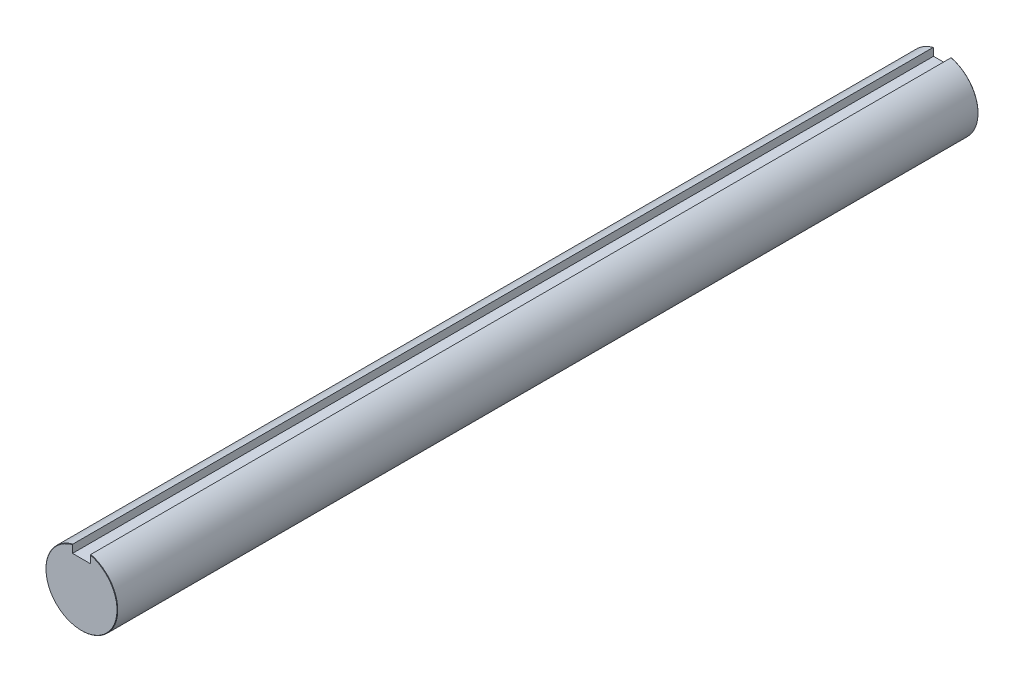
ISO-10303-21;
HEADER;
FILE_DESCRIPTION(('STEP AP214'),'2;1');
FILE_NAME('part.step','',(''),(''),'','','');
FILE_SCHEMA(('AUTOMOTIVE_DESIGN { 1 0 10303 214 1 1 1 1 }'));
ENDSEC;
DATA;
#1=APPLICATION_CONTEXT('core data for automotive mechanical design processes');
#2=APPLICATION_PROTOCOL_DEFINITION('international standard','automotive_design',2000,#1);
#3=PRODUCT_CONTEXT('',#1,'mechanical');
#4=PRODUCT('Part','Part','',(#3));
#5=PRODUCT_RELATED_PRODUCT_CATEGORY('part','',(#4));
#6=PRODUCT_DEFINITION_FORMATION('','',#4);
#7=PRODUCT_DEFINITION_CONTEXT('part definition',#1,'design');
#8=PRODUCT_DEFINITION('design','',#6,#7);
#9=PRODUCT_DEFINITION_SHAPE('','',#8);
#10=(LENGTH_UNIT() NAMED_UNIT(*) SI_UNIT(.MILLI.,.METRE.));
#11=(NAMED_UNIT(*) PLANE_ANGLE_UNIT() SI_UNIT($,.RADIAN.));
#12=(NAMED_UNIT(*) SI_UNIT($,.STERADIAN.) SOLID_ANGLE_UNIT());
#13=UNCERTAINTY_MEASURE_WITH_UNIT(LENGTH_MEASURE(1.E-05),#10,'distance_accuracy_value','');
#14=(GEOMETRIC_REPRESENTATION_CONTEXT(3) GLOBAL_UNCERTAINTY_ASSIGNED_CONTEXT((#13)) GLOBAL_UNIT_ASSIGNED_CONTEXT((#10,
#11,#12)) REPRESENTATION_CONTEXT('',''));
#15=CARTESIAN_POINT('',(0.,0.,0.));
#16=DIRECTION('',(0.,0.,1.));
#17=DIRECTION('',(1.,0.,0.));
#18=AXIS2_PLACEMENT_3D('',#15,#16,#17);
#19=CARTESIAN_POINT('',(0.,0.,76.2));
#20=DIRECTION('',(0.,0.,-1.));
#21=DIRECTION('',(-1.,0.,0.));
#22=AXIS2_PLACEMENT_3D('',#19,#20,#21);
#23=CYLINDRICAL_SURFACE('',#22,6.35);
#24=DIRECTION('',(0.,0.,-1.));
#25=VECTOR('',#24,1.);
#26=CARTESIAN_POINT('',(1.5875,6.14836106210427,76.2));
#27=LINE('',#26,#25);
#28=CARTESIAN_POINT('',(1.5875,6.14836106210427,76.1365000000001));
#29=VERTEX_POINT('',#28);
#30=CARTESIAN_POINT('',(1.5875,6.14836106210427,-76.1364999999998));
#31=VERTEX_POINT('',#30);
#32=EDGE_CURVE('E104',#29,#31,#27,.T.);
#33=ORIENTED_EDGE('',*,*,#32,.F.);
#34=CARTESIAN_POINT('',(0.,0.,76.1365000000001));
#35=DIRECTION('',(0.,0.,1.));
#36=DIRECTION('',(1.,0.,0.));
#37=AXIS2_PLACEMENT_3D('',#34,#35,#36);
#38=CIRCLE('',#37,6.35);
#39=CARTESIAN_POINT('',(-1.5875,6.14836106210427,76.1365000000001));
#40=VERTEX_POINT('',#39);
#41=EDGE_CURVE('E220',#29,#40,#38,.F.);
#42=ORIENTED_EDGE('',*,*,#41,.T.);
#43=DIRECTION('',(0.,0.,-1.));
#44=VECTOR('',#43,1.);
#45=CARTESIAN_POINT('',(-1.5875,6.14836106210427,76.2));
#46=LINE('',#45,#44);
#47=CARTESIAN_POINT('',(-1.5875,6.14836106210427,-76.1364999999998));
#48=VERTEX_POINT('',#47);
#49=EDGE_CURVE('E118',#40,#48,#46,.T.);
#50=ORIENTED_EDGE('',*,*,#49,.T.);
#51=CARTESIAN_POINT('',(0.,0.,-76.1364999999998));
#52=DIRECTION('',(0.,0.,1.));
#53=DIRECTION('',(1.,0.,0.));
#54=AXIS2_PLACEMENT_3D('',#51,#52,#53);
#55=CIRCLE('',#54,6.35);
#56=EDGE_CURVE('E219',#48,#31,#55,.T.);
#57=ORIENTED_EDGE('',*,*,#56,.T.);
#58=EDGE_LOOP('',(#33,#42,#50,#57));
#59=FACE_BOUND('',#58,.T.);
#60=ADVANCED_FACE('F34',(#59),#23,.T.);
#61=CARTESIAN_POINT('',(1.5875,4.7498,76.2));
#62=DIRECTION('',(1.,0.,0.));
#63=DIRECTION('',(0.,0.,-1.));
#64=AXIS2_PLACEMENT_3D('',#61,#62,#63);
#65=PLANE('',#64);
#66=DIRECTION('',(0.,-1.,0.));
#67=VECTOR('',#66,1.);
#68=CARTESIAN_POINT('',(1.5875,4.7498,76.2));
#69=LINE('',#68,#67);
#70=CARTESIAN_POINT('',(1.5875,6.0827564475327,76.2));
#71=VERTEX_POINT('',#70);
#72=CARTESIAN_POINT('',(1.5875,4.7498,76.2));
#73=VERTEX_POINT('',#72);
#74=EDGE_CURVE('E110',#71,#73,#69,.T.);
#75=ORIENTED_EDGE('',*,*,#74,.F.);
#76=CARTESIAN_POINT('',(1.5875,6.0827564475327,76.2));
#77=CARTESIAN_POINT('',(1.5875,6.09369234087876,76.1894185169407));
#78=CARTESIAN_POINT('',(1.5875,6.10462733876629,76.1788361087442));
#79=CARTESIAN_POINT('',(1.5875,6.12649554362348,76.1576694420775));
#80=CARTESIAN_POINT('',(1.5875,6.13742875059314,76.1470851836074));
#81=CARTESIAN_POINT('',(1.5875,6.14836106210428,76.1365000000001));
#82=B_SPLINE_CURVE_WITH_KNOTS('',3,(#76,#77,#78,#79,#80,#81),.UNSPECIFIED.,.F.,.F.,(4,2,4),(0.,
0.0456514389514626,0.0913028778996394),.UNSPECIFIED.);
#83=EDGE_CURVE('E130',#71,#29,#82,.T.);
#84=ORIENTED_EDGE('',*,*,#83,.T.);
#85=ORIENTED_EDGE('',*,*,#32,.T.);
#86=CARTESIAN_POINT('',(1.5875,6.14836106210427,-76.1364999999998));
#87=CARTESIAN_POINT('',(1.5875,6.1374287505931,-76.1470851836072));
#88=CARTESIAN_POINT('',(1.5875,6.1264955436234,-76.1576694420774));
#89=CARTESIAN_POINT('',(1.5875,6.10462733876614,-76.1788361087441));
#90=CARTESIAN_POINT('',(1.5875,6.09369234087859,-76.1894185169406));
#91=CARTESIAN_POINT('',(1.5875,6.0827564475325,-76.2));
#92=B_SPLINE_CURVE_WITH_KNOTS('',3,(#86,#87,#88,#89,#90,#91),.UNSPECIFIED.,.F.,.F.,(4,2,4),(0.,
0.0456514389483216,0.0913028778999325),.UNSPECIFIED.);
#93=CARTESIAN_POINT('',(1.5875,6.08275644753249,-76.2));
#94=VERTEX_POINT('',#93);
#95=EDGE_CURVE('E95',#31,#94,#92,.T.);
#96=ORIENTED_EDGE('',*,*,#95,.T.);
#97=DIRECTION('',(0.,-1.,0.));
#98=VECTOR('',#97,1.);
#99=CARTESIAN_POINT('',(1.5875,4.7498,-76.2));
#100=LINE('',#99,#98);
#101=CARTESIAN_POINT('',(1.5875,4.7498,-76.2));
#102=VERTEX_POINT('',#101);
#103=EDGE_CURVE('E88',#94,#102,#100,.T.);
#104=ORIENTED_EDGE('',*,*,#103,.T.);
#105=DIRECTION('',(0.,0.,-1.));
#106=VECTOR('',#105,1.);
#107=CARTESIAN_POINT('',(1.5875,4.7498,76.2));
#108=LINE('',#107,#106);
#109=EDGE_CURVE('E92',#73,#102,#108,.T.);
#110=ORIENTED_EDGE('',*,*,#109,.F.);
#111=EDGE_LOOP('',(#75,#84,#85,#96,#104,#110));
#112=FACE_BOUND('',#111,.T.);
#113=ADVANCED_FACE('F91',(#112),#65,.F.);
#114=CARTESIAN_POINT('',(1.5875,4.7498,76.2));
#115=DIRECTION('',(0.,-1.,0.));
#116=DIRECTION('',(0.,0.,-1.));
#117=AXIS2_PLACEMENT_3D('',#114,#115,#116);
#118=PLANE('',#117);
#119=ORIENTED_EDGE('',*,*,#109,.T.);
#120=DIRECTION('',(-1.,0.,0.));
#121=VECTOR('',#120,1.);
#122=CARTESIAN_POINT('',(1.5875,4.7498,-76.2));
#123=LINE('',#122,#121);
#124=CARTESIAN_POINT('',(-1.5875,4.7498,-76.2));
#125=VERTEX_POINT('',#124);
#126=EDGE_CURVE('E97',#102,#125,#123,.T.);
#127=ORIENTED_EDGE('',*,*,#126,.T.);
#128=DIRECTION('',(0.,0.,-1.));
#129=VECTOR('',#128,1.);
#130=CARTESIAN_POINT('',(-1.5875,4.7498,76.2));
#131=LINE('',#130,#129);
#132=CARTESIAN_POINT('',(-1.5875,4.7498,76.2));
#133=VERTEX_POINT('',#132);
#134=EDGE_CURVE('E105',#133,#125,#131,.T.);
#135=ORIENTED_EDGE('',*,*,#134,.F.);
#136=DIRECTION('',(-1.,0.,0.));
#137=VECTOR('',#136,1.);
#138=CARTESIAN_POINT('',(1.5875,4.7498,76.2));
#139=LINE('',#138,#137);
#140=EDGE_CURVE('E103',#73,#133,#139,.T.);
#141=ORIENTED_EDGE('',*,*,#140,.F.);
#142=EDGE_LOOP('',(#119,#127,#135,#141));
#143=FACE_BOUND('',#142,.T.);
#144=ADVANCED_FACE('F101',(#143),#118,.F.);
#145=CARTESIAN_POINT('',(-1.5875,4.7498,76.2));
#146=DIRECTION('',(-1.,0.,0.));
#147=DIRECTION('',(0.,0.,1.));
#148=AXIS2_PLACEMENT_3D('',#145,#146,#147);
#149=PLANE('',#148);
#150=ORIENTED_EDGE('',*,*,#49,.F.);
#151=CARTESIAN_POINT('',(-1.5875,6.14836106210427,76.1365000000001));
#152=CARTESIAN_POINT('',(-1.5875,6.13742875059314,76.1470851836074));
#153=CARTESIAN_POINT('',(-1.5875,6.12649554362347,76.1576694420775));
#154=CARTESIAN_POINT('',(-1.5875,6.10462733876629,76.1788361087442));
#155=CARTESIAN_POINT('',(-1.5875,6.09369234087876,76.1894185169407));
#156=CARTESIAN_POINT('',(-1.5875,6.08275644753271,76.2));
#157=B_SPLINE_CURVE_WITH_KNOTS('',3,(#151,#152,#153,#154,#155,#156),.UNSPECIFIED.,.F.,.F.,(4,2,
4),(0.,0.0456514389481653,0.0913028778996338),.UNSPECIFIED.);
#158=CARTESIAN_POINT('',(-1.5875,6.0827564475327,76.2));
#159=VERTEX_POINT('',#158);
#160=EDGE_CURVE('E43',#40,#159,#157,.T.);
#161=ORIENTED_EDGE('',*,*,#160,.T.);
#162=DIRECTION('',(0.,1.,0.));
#163=VECTOR('',#162,1.);
#164=CARTESIAN_POINT('',(-1.5875,4.7498,76.2));
#165=LINE('',#164,#163);
#166=EDGE_CURVE('E115',#133,#159,#165,.T.);
#167=ORIENTED_EDGE('',*,*,#166,.F.);
#168=ORIENTED_EDGE('',*,*,#134,.T.);
#169=DIRECTION('',(0.,1.,0.));
#170=VECTOR('',#169,1.);
#171=CARTESIAN_POINT('',(-1.5875,4.7498,-76.2));
#172=LINE('',#171,#170);
#173=CARTESIAN_POINT('',(-1.5875,6.08275644753249,-76.2));
#174=VERTEX_POINT('',#173);
#175=EDGE_CURVE('E108',#125,#174,#172,.T.);
#176=ORIENTED_EDGE('',*,*,#175,.T.);
#177=CARTESIAN_POINT('',(-1.5875,6.08275644753249,-76.2));
#178=CARTESIAN_POINT('',(-1.5875,6.09369234087858,-76.1894185169406));
#179=CARTESIAN_POINT('',(-1.5875,6.10462733876614,-76.1788361087441));
#180=CARTESIAN_POINT('',(-1.5875,6.1264955436234,-76.1576694420774));
#181=CARTESIAN_POINT('',(-1.5875,6.1374287505931,-76.1470851836072));
#182=CARTESIAN_POINT('',(-1.5875,6.14836106210428,-76.1364999999998));
#183=B_SPLINE_CURVE_WITH_KNOTS('',3,(#177,#178,#179,#180,#181,#182),.UNSPECIFIED.,.F.,.F.,(4,2,
4),(0.,0.0456514389516139,0.0913028778999381),.UNSPECIFIED.);
#184=EDGE_CURVE('E55',#174,#48,#183,.T.);
#185=ORIENTED_EDGE('',*,*,#184,.T.);
#186=EDGE_LOOP('',(#150,#161,#167,#168,#176,#185));
#187=FACE_BOUND('',#186,.T.);
#188=ADVANCED_FACE('F156',(#187),#149,.F.);
#189=CARTESIAN_POINT('',(0.,0.,76.2));
#190=DIRECTION('',(0.,0.,1.));
#191=DIRECTION('',(1.,0.,0.));
#192=AXIS2_PLACEMENT_3D('',#189,#190,#191);
#193=PLANE('',#192);
#194=ORIENTED_EDGE('',*,*,#166,.T.);
#195=CARTESIAN_POINT('',(0.,0.,76.2));
#196=DIRECTION('',(0.,0.,1.));
#197=DIRECTION('',(1.,0.,0.));
#198=AXIS2_PLACEMENT_3D('',#195,#196,#197);
#199=CIRCLE('',#198,6.28650000000005);
#200=EDGE_CURVE('E122',#159,#71,#199,.T.);
#201=ORIENTED_EDGE('',*,*,#200,.T.);
#202=ORIENTED_EDGE('',*,*,#74,.T.);
#203=ORIENTED_EDGE('',*,*,#140,.T.);
#204=EDGE_LOOP('',(#194,#201,#202,#203));
#205=FACE_BOUND('',#204,.T.);
#206=ADVANCED_FACE('F160',(#205),#193,.T.);
#207=CARTESIAN_POINT('',(0.,0.,-76.2));
#208=DIRECTION('',(0.,0.,1.));
#209=DIRECTION('',(1.,0.,0.));
#210=AXIS2_PLACEMENT_3D('',#207,#208,#209);
#211=PLANE('',#210);
#212=ORIENTED_EDGE('',*,*,#103,.F.);
#213=CARTESIAN_POINT('',(0.,0.,-76.2));
#214=DIRECTION('',(0.,0.,1.));
#215=DIRECTION('',(1.,0.,0.));
#216=AXIS2_PLACEMENT_3D('',#213,#214,#215);
#217=CIRCLE('',#216,6.28649999999985);
#218=EDGE_CURVE('E11',#94,#174,#217,.F.);
#219=ORIENTED_EDGE('',*,*,#218,.T.);
#220=ORIENTED_EDGE('',*,*,#175,.F.);
#221=ORIENTED_EDGE('',*,*,#126,.F.);
#222=EDGE_LOOP('',(#212,#219,#220,#221));
#223=FACE_BOUND('',#222,.T.);
#224=ADVANCED_FACE('F107',(#223),#211,.F.);
#225=CARTESIAN_POINT('',(0.,0.,76.2));
#226=DIRECTION('',(0.,0.,-1.));
#227=DIRECTION('',(-1.,0.,0.));
#228=AXIS2_PLACEMENT_3D('',#225,#226,#227);
#229=CONICAL_SURFACE('',#228,6.28650000000005,0.785398163397387);
#230=ORIENTED_EDGE('',*,*,#160,.F.);
#231=ORIENTED_EDGE('',*,*,#41,.F.);
#232=ORIENTED_EDGE('',*,*,#83,.F.);
#233=ORIENTED_EDGE('',*,*,#200,.F.);
#234=EDGE_LOOP('',(#230,#231,#232,#233));
#235=FACE_BOUND('',#234,.T.);
#236=ADVANCED_FACE('F143',(#235),#229,.T.);
#237=CARTESIAN_POINT('',(0.,0.,-76.1364999999998));
#238=DIRECTION('',(0.,0.,1.));
#239=DIRECTION('',(1.,0.,0.));
#240=AXIS2_PLACEMENT_3D('',#237,#238,#239);
#241=CONICAL_SURFACE('',#240,6.35,0.78539816339738);
#242=ORIENTED_EDGE('',*,*,#184,.F.);
#243=ORIENTED_EDGE('',*,*,#218,.F.);
#244=ORIENTED_EDGE('',*,*,#95,.F.);
#245=ORIENTED_EDGE('',*,*,#56,.F.);
#246=EDGE_LOOP('',(#242,#243,#244,#245));
#247=FACE_BOUND('',#246,.T.);
#248=ADVANCED_FACE('F36',(#247),#241,.T.);
#249=CLOSED_SHELL('',(#60,#113,#144,#188,#206,#224,#236,#248));
#250=MANIFOLD_SOLID_BREP('B2',#249);
#251=ADVANCED_BREP_SHAPE_REPRESENTATION('',(#18,#250),#14);
#252=SHAPE_DEFINITION_REPRESENTATION(#9,#251);
ENDSEC;
END-ISO-10303-21;
